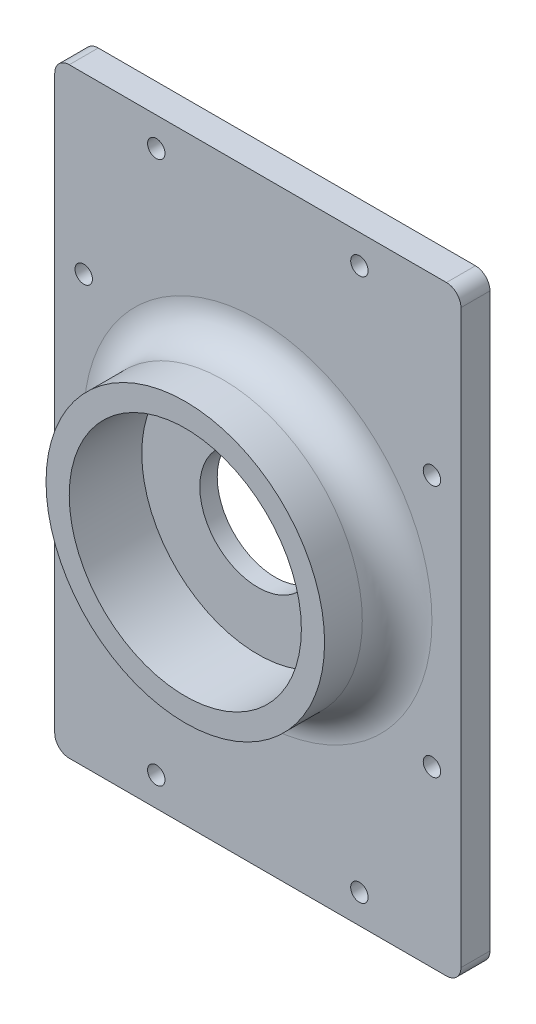
ISO-10303-21;
HEADER;
FILE_DESCRIPTION(('STEP AP214'),'2;1');
FILE_NAME('part.step','',(''),(''),'','','');
FILE_SCHEMA(('AUTOMOTIVE_DESIGN { 1 0 10303 214 1 1 1 1 }'));
ENDSEC;
DATA;
#1=APPLICATION_CONTEXT('core data for automotive mechanical design processes');
#2=APPLICATION_PROTOCOL_DEFINITION('international standard','automotive_design',2000,#1);
#3=PRODUCT_CONTEXT('',#1,'mechanical');
#4=PRODUCT('Part','Part','',(#3));
#5=PRODUCT_RELATED_PRODUCT_CATEGORY('part','',(#4));
#6=PRODUCT_DEFINITION_FORMATION('','',#4);
#7=PRODUCT_DEFINITION_CONTEXT('part definition',#1,'design');
#8=PRODUCT_DEFINITION('design','',#6,#7);
#9=PRODUCT_DEFINITION_SHAPE('','',#8);
#10=(LENGTH_UNIT() NAMED_UNIT(*) SI_UNIT(.MILLI.,.METRE.));
#11=(NAMED_UNIT(*) PLANE_ANGLE_UNIT() SI_UNIT($,.RADIAN.));
#12=(NAMED_UNIT(*) SI_UNIT($,.STERADIAN.) SOLID_ANGLE_UNIT());
#13=UNCERTAINTY_MEASURE_WITH_UNIT(LENGTH_MEASURE(1.E-05),#10,'distance_accuracy_value','');
#14=(GEOMETRIC_REPRESENTATION_CONTEXT(3) GLOBAL_UNCERTAINTY_ASSIGNED_CONTEXT((#13)) GLOBAL_UNIT_ASSIGNED_CONTEXT((#10,
#11,#12)) REPRESENTATION_CONTEXT('',''));
#15=CARTESIAN_POINT('',(0.,0.,0.));
#16=DIRECTION('',(0.,0.,1.));
#17=DIRECTION('',(1.,0.,0.));
#18=AXIS2_PLACEMENT_3D('',#15,#16,#17);
#19=CARTESIAN_POINT('',(0.,0.,-15.));
#20=DIRECTION('',(0.,0.,1.));
#21=DIRECTION('',(1.,0.,0.));
#22=AXIS2_PLACEMENT_3D('',#19,#20,#21);
#23=CYLINDRICAL_SURFACE('',#22,20.);
#24=CARTESIAN_POINT('',(0.,0.,10.));
#25=DIRECTION('',(0.,0.,-1.));
#26=DIRECTION('',(-1.,0.,0.));
#27=AXIS2_PLACEMENT_3D('',#24,#25,#26);
#28=CIRCLE('',#27,20.);
#29=CARTESIAN_POINT('',(-20.,0.,10.));
#30=VERTEX_POINT('',#29);
#31=EDGE_CURVE('E209',#30,#30,#28,.T.);
#32=ORIENTED_EDGE('',*,*,#31,.F.);
#33=EDGE_LOOP('',(#32));
#34=FACE_BOUND('',#33,.T.);
#35=CARTESIAN_POINT('',(0.,0.,3.99999999999998));
#36=DIRECTION('',(0.,0.,-1.));
#37=DIRECTION('',(-1.,0.,0.));
#38=AXIS2_PLACEMENT_3D('',#35,#36,#37);
#39=CIRCLE('',#38,20.);
#40=CARTESIAN_POINT('',(-20.,0.,3.99999999999998));
#41=VERTEX_POINT('',#40);
#42=EDGE_CURVE('E206',#41,#41,#39,.T.);
#43=ORIENTED_EDGE('',*,*,#42,.T.);
#44=EDGE_LOOP('',(#43));
#45=FACE_BOUND('',#44,.T.);
#46=ADVANCED_FACE('F46',(#34,#45),#23,.F.);
#47=CARTESIAN_POINT('',(0.,0.,10.));
#48=DIRECTION('',(0.,0.,-1.));
#49=DIRECTION('',(-1.,0.,0.));
#50=AXIS2_PLACEMENT_3D('',#47,#48,#49);
#51=PLANE('',#50);
#52=CARTESIAN_POINT('',(0.,0.,10.));
#53=DIRECTION('',(0.,0.,-1.));
#54=DIRECTION('',(-1.,0.,0.));
#55=AXIS2_PLACEMENT_3D('',#52,#53,#54);
#56=CIRCLE('',#55,60.);
#57=CARTESIAN_POINT('',(-60.,0.,10.));
#58=VERTEX_POINT('',#57);
#59=EDGE_CURVE('E55',#58,#58,#56,.T.);
#60=ORIENTED_EDGE('',*,*,#59,.T.);
#61=EDGE_LOOP('',(#60));
#62=FACE_BOUND('',#61,.T.);
#63=DIRECTION('',(1.,0.,0.));
#64=VECTOR('',#63,1.);
#65=CARTESIAN_POINT('',(-70.0000000000042,-103.5,10.));
#66=LINE('',#65,#64);
#67=CARTESIAN_POINT('',(-65.0000000000042,-103.5,10.));
#68=VERTEX_POINT('',#67);
#69=CARTESIAN_POINT('',(65.0000000000042,-103.5,10.));
#70=VERTEX_POINT('',#69);
#71=EDGE_CURVE('E157',#68,#70,#66,.T.);
#72=ORIENTED_EDGE('',*,*,#71,.T.);
#73=CARTESIAN_POINT('',(65.0000000000042,-98.5,10.));
#74=DIRECTION('',(0.,0.,-1.));
#75=DIRECTION('',(-1.,0.,0.));
#76=AXIS2_PLACEMENT_3D('',#73,#74,#75);
#77=CIRCLE('',#76,5.);
#78=CARTESIAN_POINT('',(70.0000000000042,-98.5,10.));
#79=VERTEX_POINT('',#78);
#80=EDGE_CURVE('E190',#70,#79,#77,.F.);
#81=ORIENTED_EDGE('',*,*,#80,.T.);
#82=DIRECTION('',(0.,1.,0.));
#83=VECTOR('',#82,1.);
#84=CARTESIAN_POINT('',(70.0000000000042,-103.5,10.));
#85=LINE('',#84,#83);
#86=CARTESIAN_POINT('',(70.0000000000042,98.5,10.));
#87=VERTEX_POINT('',#86);
#88=EDGE_CURVE('E135',#79,#87,#85,.T.);
#89=ORIENTED_EDGE('',*,*,#88,.T.);
#90=CARTESIAN_POINT('',(65.0000000000042,98.5,10.));
#91=DIRECTION('',(0.,0.,-1.));
#92=DIRECTION('',(-1.,0.,0.));
#93=AXIS2_PLACEMENT_3D('',#90,#91,#92);
#94=CIRCLE('',#93,5.);
#95=CARTESIAN_POINT('',(65.0000000000042,103.5,10.));
#96=VERTEX_POINT('',#95);
#97=EDGE_CURVE('E184',#87,#96,#94,.F.);
#98=ORIENTED_EDGE('',*,*,#97,.T.);
#99=DIRECTION('',(-1.,0.,0.));
#100=VECTOR('',#99,1.);
#101=CARTESIAN_POINT('',(-70.0000000000042,103.5,10.));
#102=LINE('',#101,#100);
#103=CARTESIAN_POINT('',(-65.0000000000042,103.5,10.));
#104=VERTEX_POINT('',#103);
#105=EDGE_CURVE('E325',#96,#104,#102,.T.);
#106=ORIENTED_EDGE('',*,*,#105,.T.);
#107=CARTESIAN_POINT('',(-65.0000000000042,98.5,10.));
#108=DIRECTION('',(0.,0.,-1.));
#109=DIRECTION('',(-1.,0.,0.));
#110=AXIS2_PLACEMENT_3D('',#107,#108,#109);
#111=CIRCLE('',#110,5.);
#112=CARTESIAN_POINT('',(-70.0000000000042,98.5,10.));
#113=VERTEX_POINT('',#112);
#114=EDGE_CURVE('E69',#104,#113,#111,.F.);
#115=ORIENTED_EDGE('',*,*,#114,.T.);
#116=DIRECTION('',(0.,-1.,0.));
#117=VECTOR('',#116,1.);
#118=CARTESIAN_POINT('',(-70.0000000000042,103.5,10.));
#119=LINE('',#118,#117);
#120=CARTESIAN_POINT('',(-70.0000000000042,-98.5,10.));
#121=VERTEX_POINT('',#120);
#122=EDGE_CURVE('E318',#113,#121,#119,.T.);
#123=ORIENTED_EDGE('',*,*,#122,.T.);
#124=CARTESIAN_POINT('',(-65.0000000000042,-98.5,10.));
#125=DIRECTION('',(0.,0.,-1.));
#126=DIRECTION('',(-1.,0.,0.));
#127=AXIS2_PLACEMENT_3D('',#124,#125,#126);
#128=CIRCLE('',#127,5.);
#129=EDGE_CURVE('E187',#121,#68,#128,.F.);
#130=ORIENTED_EDGE('',*,*,#129,.T.);
#131=EDGE_LOOP('',(#72,#81,#89,#98,#106,#115,#123,#130));
#132=FACE_BOUND('',#131,.T.);
#133=CARTESIAN_POINT('',(-35.0000000000042,93.5,10.));
#134=DIRECTION('',(0.,0.,1.));
#135=DIRECTION('',(1.,0.,0.));
#136=AXIS2_PLACEMENT_3D('',#133,#134,#135);
#137=CIRCLE('',#136,2.99999999999999);
#138=CARTESIAN_POINT('',(-32.0000000000042,93.5,10.));
#139=VERTEX_POINT('',#138);
#140=EDGE_CURVE('E146',#139,#139,#137,.T.);
#141=ORIENTED_EDGE('',*,*,#140,.F.);
#142=EDGE_LOOP('',(#141));
#143=FACE_BOUND('',#142,.T.);
#144=CARTESIAN_POINT('',(35.0000000000041,93.4999999999999,10.));
#145=DIRECTION('',(0.,0.,1.));
#146=DIRECTION('',(1.,0.,0.));
#147=AXIS2_PLACEMENT_3D('',#144,#145,#146);
#148=CIRCLE('',#147,2.99999999999999);
#149=CARTESIAN_POINT('',(38.0000000000041,93.4999999999999,10.));
#150=VERTEX_POINT('',#149);
#151=EDGE_CURVE('E333',#150,#150,#148,.T.);
#152=ORIENTED_EDGE('',*,*,#151,.F.);
#153=EDGE_LOOP('',(#152));
#154=FACE_BOUND('',#153,.T.);
#155=CARTESIAN_POINT('',(35.0000000000041,-93.4999999999999,10.));
#156=DIRECTION('',(0.,0.,1.));
#157=DIRECTION('',(-1.,0.,0.));
#158=AXIS2_PLACEMENT_3D('',#155,#156,#157);
#159=CIRCLE('',#158,2.99999999999999);
#160=CARTESIAN_POINT('',(32.0000000000041,-93.4999999999999,10.));
#161=VERTEX_POINT('',#160);
#162=EDGE_CURVE('E339',#161,#161,#159,.T.);
#163=ORIENTED_EDGE('',*,*,#162,.F.);
#164=EDGE_LOOP('',(#163));
#165=FACE_BOUND('',#164,.T.);
#166=CARTESIAN_POINT('',(-35.0000000000042,-93.5,10.));
#167=DIRECTION('',(0.,0.,1.));
#168=DIRECTION('',(-1.,0.,0.));
#169=AXIS2_PLACEMENT_3D('',#166,#167,#168);
#170=CIRCLE('',#169,2.99999999999999);
#171=CARTESIAN_POINT('',(-38.0000000000042,-93.5,10.));
#172=VERTEX_POINT('',#171);
#173=EDGE_CURVE('E347',#172,#172,#170,.T.);
#174=ORIENTED_EDGE('',*,*,#173,.F.);
#175=EDGE_LOOP('',(#174));
#176=FACE_BOUND('',#175,.T.);
#177=CARTESIAN_POINT('',(-60.0000000000042,-43.5,10.));
#178=DIRECTION('',(0.,0.,1.));
#179=DIRECTION('',(1.,0.,0.));
#180=AXIS2_PLACEMENT_3D('',#177,#178,#179);
#181=CIRCLE('',#180,2.99999999999999);
#182=CARTESIAN_POINT('',(-57.0000000000042,-43.5,10.));
#183=VERTEX_POINT('',#182);
#184=EDGE_CURVE('E355',#183,#183,#181,.T.);
#185=ORIENTED_EDGE('',*,*,#184,.F.);
#186=EDGE_LOOP('',(#185));
#187=FACE_BOUND('',#186,.T.);
#188=CARTESIAN_POINT('',(-60.0000000000042,43.5,10.));
#189=DIRECTION('',(0.,0.,1.));
#190=DIRECTION('',(1.,0.,0.));
#191=AXIS2_PLACEMENT_3D('',#188,#189,#190);
#192=CIRCLE('',#191,2.99999999999999);
#193=CARTESIAN_POINT('',(-57.0000000000042,43.5,10.));
#194=VERTEX_POINT('',#193);
#195=EDGE_CURVE('E363',#194,#194,#192,.T.);
#196=ORIENTED_EDGE('',*,*,#195,.F.);
#197=EDGE_LOOP('',(#196));
#198=FACE_BOUND('',#197,.T.);
#199=CARTESIAN_POINT('',(60.0000000000042,43.5,10.));
#200=DIRECTION('',(0.,0.,1.));
#201=DIRECTION('',(-1.,0.,0.));
#202=AXIS2_PLACEMENT_3D('',#199,#200,#201);
#203=CIRCLE('',#202,2.99999999999999);
#204=CARTESIAN_POINT('',(57.0000000000042,43.5,10.));
#205=VERTEX_POINT('',#204);
#206=EDGE_CURVE('E371',#205,#205,#203,.T.);
#207=ORIENTED_EDGE('',*,*,#206,.F.);
#208=EDGE_LOOP('',(#207));
#209=FACE_BOUND('',#208,.T.);
#210=CARTESIAN_POINT('',(60.0000000000042,-43.5,10.));
#211=DIRECTION('',(0.,0.,1.));
#212=DIRECTION('',(-1.,0.,0.));
#213=AXIS2_PLACEMENT_3D('',#210,#211,#212);
#214=CIRCLE('',#213,2.99999999999999);
#215=CARTESIAN_POINT('',(57.0000000000042,-43.5,10.));
#216=VERTEX_POINT('',#215);
#217=EDGE_CURVE('E379',#216,#216,#214,.T.);
#218=ORIENTED_EDGE('',*,*,#217,.F.);
#219=EDGE_LOOP('',(#218));
#220=FACE_BOUND('',#219,.T.);
#221=ADVANCED_FACE('F215',(#62,#132,#143,#154,#165,#176,#187,#198,#209,#220),#51,.F.);
#222=CARTESIAN_POINT('',(0.,0.,0.));
#223=DIRECTION('',(0.,0.,-1.));
#224=DIRECTION('',(-1.,0.,0.));
#225=AXIS2_PLACEMENT_3D('',#222,#223,#224);
#226=PLANE('',#225);
#227=CARTESIAN_POINT('',(0.,0.,0.));
#228=DIRECTION('',(0.,0.,-1.));
#229=DIRECTION('',(-1.,0.,0.));
#230=AXIS2_PLACEMENT_3D('',#227,#228,#229);
#231=CIRCLE('',#230,30.);
#232=CARTESIAN_POINT('',(-30.,0.,0.));
#233=VERTEX_POINT('',#232);
#234=EDGE_CURVE('E401',#233,#233,#231,.T.);
#235=ORIENTED_EDGE('',*,*,#234,.F.);
#236=EDGE_LOOP('',(#235));
#237=FACE_BOUND('',#236,.T.);
#238=CARTESIAN_POINT('',(60.0000000000042,43.5,0.));
#239=DIRECTION('',(0.,0.,1.));
#240=DIRECTION('',(-1.,0.,0.));
#241=AXIS2_PLACEMENT_3D('',#238,#239,#240);
#242=CIRCLE('',#241,2.99999999999999);
#243=CARTESIAN_POINT('',(57.0000000000042,43.5,0.));
#244=VERTEX_POINT('',#243);
#245=EDGE_CURVE('E375',#244,#244,#242,.T.);
#246=ORIENTED_EDGE('',*,*,#245,.T.);
#247=EDGE_LOOP('',(#246));
#248=FACE_BOUND('',#247,.T.);
#249=CARTESIAN_POINT('',(-60.0000000000042,-43.5,0.));
#250=DIRECTION('',(0.,0.,1.));
#251=DIRECTION('',(1.,0.,0.));
#252=AXIS2_PLACEMENT_3D('',#249,#250,#251);
#253=CIRCLE('',#252,2.99999999999999);
#254=CARTESIAN_POINT('',(-57.0000000000042,-43.5,0.));
#255=VERTEX_POINT('',#254);
#256=EDGE_CURVE('E359',#255,#255,#253,.T.);
#257=ORIENTED_EDGE('',*,*,#256,.T.);
#258=EDGE_LOOP('',(#257));
#259=FACE_BOUND('',#258,.T.);
#260=CARTESIAN_POINT('',(35.0000000000041,-93.4999999999999,0.));
#261=DIRECTION('',(0.,0.,1.));
#262=DIRECTION('',(-1.,0.,0.));
#263=AXIS2_PLACEMENT_3D('',#260,#261,#262);
#264=CIRCLE('',#263,2.99999999999999);
#265=CARTESIAN_POINT('',(32.0000000000041,-93.4999999999999,0.));
#266=VERTEX_POINT('',#265);
#267=EDGE_CURVE('E343',#266,#266,#264,.T.);
#268=ORIENTED_EDGE('',*,*,#267,.T.);
#269=EDGE_LOOP('',(#268));
#270=FACE_BOUND('',#269,.T.);
#271=CARTESIAN_POINT('',(-35.0000000000042,93.5,0.));
#272=DIRECTION('',(0.,0.,1.));
#273=DIRECTION('',(1.,0.,0.));
#274=AXIS2_PLACEMENT_3D('',#271,#272,#273);
#275=CIRCLE('',#274,2.99999999999999);
#276=CARTESIAN_POINT('',(-32.0000000000042,93.5,0.));
#277=VERTEX_POINT('',#276);
#278=EDGE_CURVE('E154',#277,#277,#275,.T.);
#279=ORIENTED_EDGE('',*,*,#278,.T.);
#280=EDGE_LOOP('',(#279));
#281=FACE_BOUND('',#280,.T.);
#282=DIRECTION('',(0.,1.,0.));
#283=VECTOR('',#282,1.);
#284=CARTESIAN_POINT('',(70.0000000000042,-103.5,0.));
#285=LINE('',#284,#283);
#286=CARTESIAN_POINT('',(70.0000000000042,-98.5,0.));
#287=VERTEX_POINT('',#286);
#288=CARTESIAN_POINT('',(70.0000000000042,98.5,0.));
#289=VERTEX_POINT('',#288);
#290=EDGE_CURVE('E132',#287,#289,#285,.T.);
#291=ORIENTED_EDGE('',*,*,#290,.F.);
#292=CARTESIAN_POINT('',(65.0000000000042,-98.5,0.));
#293=DIRECTION('',(0.,0.,-1.));
#294=DIRECTION('',(-1.,0.,0.));
#295=AXIS2_PLACEMENT_3D('',#292,#293,#294);
#296=CIRCLE('',#295,5.);
#297=CARTESIAN_POINT('',(65.0000000000042,-103.5,0.));
#298=VERTEX_POINT('',#297);
#299=EDGE_CURVE('E114',#287,#298,#296,.T.);
#300=ORIENTED_EDGE('',*,*,#299,.T.);
#301=DIRECTION('',(1.,0.,0.));
#302=VECTOR('',#301,1.);
#303=CARTESIAN_POINT('',(-70.0000000000042,-103.5,0.));
#304=LINE('',#303,#302);
#305=CARTESIAN_POINT('',(-65.0000000000042,-103.5,0.));
#306=VERTEX_POINT('',#305);
#307=EDGE_CURVE('E162',#306,#298,#304,.T.);
#308=ORIENTED_EDGE('',*,*,#307,.F.);
#309=CARTESIAN_POINT('',(-65.0000000000042,-98.5,0.));
#310=DIRECTION('',(0.,0.,-1.));
#311=DIRECTION('',(-1.,0.,0.));
#312=AXIS2_PLACEMENT_3D('',#309,#310,#311);
#313=CIRCLE('',#312,5.);
#314=CARTESIAN_POINT('',(-70.0000000000042,-98.5,0.));
#315=VERTEX_POINT('',#314);
#316=EDGE_CURVE('E126',#306,#315,#313,.T.);
#317=ORIENTED_EDGE('',*,*,#316,.T.);
#318=DIRECTION('',(0.,-1.,0.));
#319=VECTOR('',#318,1.);
#320=CARTESIAN_POINT('',(-70.0000000000042,103.5,0.));
#321=LINE('',#320,#319);
#322=CARTESIAN_POINT('',(-70.0000000000042,98.5,0.));
#323=VERTEX_POINT('',#322);
#324=EDGE_CURVE('E151',#323,#315,#321,.T.);
#325=ORIENTED_EDGE('',*,*,#324,.F.);
#326=CARTESIAN_POINT('',(-65.0000000000042,98.5,0.));
#327=DIRECTION('',(0.,0.,-1.));
#328=DIRECTION('',(-1.,0.,0.));
#329=AXIS2_PLACEMENT_3D('',#326,#327,#328);
#330=CIRCLE('',#329,5.);
#331=CARTESIAN_POINT('',(-65.0000000000042,103.5,0.));
#332=VERTEX_POINT('',#331);
#333=EDGE_CURVE('E137',#323,#332,#330,.T.);
#334=ORIENTED_EDGE('',*,*,#333,.T.);
#335=DIRECTION('',(-1.,0.,0.));
#336=VECTOR('',#335,1.);
#337=CARTESIAN_POINT('',(-70.0000000000042,103.5,0.));
#338=LINE('',#337,#336);
#339=CARTESIAN_POINT('',(65.0000000000042,103.5,0.));
#340=VERTEX_POINT('',#339);
#341=EDGE_CURVE('E145',#340,#332,#338,.T.);
#342=ORIENTED_EDGE('',*,*,#341,.F.);
#343=CARTESIAN_POINT('',(65.0000000000042,98.5,0.));
#344=DIRECTION('',(0.,0.,-1.));
#345=DIRECTION('',(-1.,0.,0.));
#346=AXIS2_PLACEMENT_3D('',#343,#344,#345);
#347=CIRCLE('',#346,5.);
#348=EDGE_CURVE('E143',#340,#289,#347,.T.);
#349=ORIENTED_EDGE('',*,*,#348,.T.);
#350=EDGE_LOOP('',(#291,#300,#308,#317,#325,#334,#342,#349));
#351=FACE_BOUND('',#350,.T.);
#352=CARTESIAN_POINT('',(35.0000000000041,93.4999999999999,0.));
#353=DIRECTION('',(0.,0.,1.));
#354=DIRECTION('',(1.,0.,0.));
#355=AXIS2_PLACEMENT_3D('',#352,#353,#354);
#356=CIRCLE('',#355,2.99999999999999);
#357=CARTESIAN_POINT('',(38.0000000000041,93.4999999999999,0.));
#358=VERTEX_POINT('',#357);
#359=EDGE_CURVE('E335',#358,#358,#356,.T.);
#360=ORIENTED_EDGE('',*,*,#359,.T.);
#361=EDGE_LOOP('',(#360));
#362=FACE_BOUND('',#361,.T.);
#363=CARTESIAN_POINT('',(-35.0000000000042,-93.5,0.));
#364=DIRECTION('',(0.,0.,1.));
#365=DIRECTION('',(-1.,0.,0.));
#366=AXIS2_PLACEMENT_3D('',#363,#364,#365);
#367=CIRCLE('',#366,2.99999999999999);
#368=CARTESIAN_POINT('',(-38.0000000000042,-93.5,0.));
#369=VERTEX_POINT('',#368);
#370=EDGE_CURVE('E351',#369,#369,#367,.T.);
#371=ORIENTED_EDGE('',*,*,#370,.T.);
#372=EDGE_LOOP('',(#371));
#373=FACE_BOUND('',#372,.T.);
#374=CARTESIAN_POINT('',(-60.0000000000042,43.5,0.));
#375=DIRECTION('',(0.,0.,1.));
#376=DIRECTION('',(1.,0.,0.));
#377=AXIS2_PLACEMENT_3D('',#374,#375,#376);
#378=CIRCLE('',#377,2.99999999999999);
#379=CARTESIAN_POINT('',(-57.0000000000042,43.5,0.));
#380=VERTEX_POINT('',#379);
#381=EDGE_CURVE('E367',#380,#380,#378,.T.);
#382=ORIENTED_EDGE('',*,*,#381,.T.);
#383=EDGE_LOOP('',(#382));
#384=FACE_BOUND('',#383,.T.);
#385=CARTESIAN_POINT('',(60.0000000000042,-43.5,0.));
#386=DIRECTION('',(0.,0.,1.));
#387=DIRECTION('',(-1.,0.,0.));
#388=AXIS2_PLACEMENT_3D('',#385,#386,#387);
#389=CIRCLE('',#388,2.99999999999999);
#390=CARTESIAN_POINT('',(57.0000000000042,-43.5,0.));
#391=VERTEX_POINT('',#390);
#392=EDGE_CURVE('E383',#391,#391,#389,.T.);
#393=ORIENTED_EDGE('',*,*,#392,.T.);
#394=EDGE_LOOP('',(#393));
#395=FACE_BOUND('',#394,.T.);
#396=ADVANCED_FACE('F140',(#237,#248,#259,#270,#281,#351,#362,#373,#384,#395),#226,.T.);
#397=CARTESIAN_POINT('',(70.0000000000042,-103.5,10.));
#398=DIRECTION('',(-1.,0.,0.));
#399=DIRECTION('',(0.,0.,1.));
#400=AXIS2_PLACEMENT_3D('',#397,#398,#399);
#401=PLANE('',#400);
#402=ORIENTED_EDGE('',*,*,#88,.F.);
#403=DIRECTION('',(0.,0.,-1.));
#404=VECTOR('',#403,1.);
#405=CARTESIAN_POINT('',(70.0000000000042,-98.5,10.));
#406=LINE('',#405,#404);
#407=EDGE_CURVE('E118',#79,#287,#406,.T.);
#408=ORIENTED_EDGE('',*,*,#407,.T.);
#409=ORIENTED_EDGE('',*,*,#290,.T.);
#410=DIRECTION('',(0.,0.,-1.));
#411=VECTOR('',#410,1.);
#412=CARTESIAN_POINT('',(70.0000000000042,98.5,10.));
#413=LINE('',#412,#411);
#414=EDGE_CURVE('E138',#289,#87,#413,.F.);
#415=ORIENTED_EDGE('',*,*,#414,.T.);
#416=EDGE_LOOP('',(#402,#408,#409,#415));
#417=FACE_BOUND('',#416,.T.);
#418=ADVANCED_FACE('F131',(#417),#401,.F.);
#419=CARTESIAN_POINT('',(-70.0000000000042,103.5,10.));
#420=DIRECTION('',(0.,-1.,0.));
#421=DIRECTION('',(0.,0.,-1.));
#422=AXIS2_PLACEMENT_3D('',#419,#420,#421);
#423=PLANE('',#422);
#424=ORIENTED_EDGE('',*,*,#105,.F.);
#425=DIRECTION('',(0.,0.,-1.));
#426=VECTOR('',#425,1.);
#427=CARTESIAN_POINT('',(65.0000000000042,103.5,10.));
#428=LINE('',#427,#426);
#429=EDGE_CURVE('E202',#96,#340,#428,.T.);
#430=ORIENTED_EDGE('',*,*,#429,.T.);
#431=ORIENTED_EDGE('',*,*,#341,.T.);
#432=DIRECTION('',(0.,0.,-1.));
#433=VECTOR('',#432,1.);
#434=CARTESIAN_POINT('',(-65.0000000000042,103.5,10.));
#435=LINE('',#434,#433);
#436=EDGE_CURVE('E199',#332,#104,#435,.F.);
#437=ORIENTED_EDGE('',*,*,#436,.T.);
#438=EDGE_LOOP('',(#424,#430,#431,#437));
#439=FACE_BOUND('',#438,.T.);
#440=ADVANCED_FACE('F293',(#439),#423,.F.);
#441=CARTESIAN_POINT('',(-70.0000000000042,103.5,10.));
#442=DIRECTION('',(1.,0.,0.));
#443=DIRECTION('',(0.,0.,-1.));
#444=AXIS2_PLACEMENT_3D('',#441,#442,#443);
#445=PLANE('',#444);
#446=ORIENTED_EDGE('',*,*,#324,.T.);
#447=DIRECTION('',(0.,0.,-1.));
#448=VECTOR('',#447,1.);
#449=CARTESIAN_POINT('',(-70.0000000000042,-98.5,10.));
#450=LINE('',#449,#448);
#451=EDGE_CURVE('E62',#315,#121,#450,.F.);
#452=ORIENTED_EDGE('',*,*,#451,.T.);
#453=ORIENTED_EDGE('',*,*,#122,.F.);
#454=DIRECTION('',(0.,0.,-1.));
#455=VECTOR('',#454,1.);
#456=CARTESIAN_POINT('',(-70.0000000000042,98.5,10.));
#457=LINE('',#456,#455);
#458=EDGE_CURVE('E193',#113,#323,#457,.T.);
#459=ORIENTED_EDGE('',*,*,#458,.T.);
#460=EDGE_LOOP('',(#446,#452,#453,#459));
#461=FACE_BOUND('',#460,.T.);
#462=ADVANCED_FACE('F289',(#461),#445,.F.);
#463=CARTESIAN_POINT('',(-70.0000000000042,-103.5,10.));
#464=DIRECTION('',(0.,1.,0.));
#465=DIRECTION('',(0.,0.,1.));
#466=AXIS2_PLACEMENT_3D('',#463,#464,#465);
#467=PLANE('',#466);
#468=ORIENTED_EDGE('',*,*,#307,.T.);
#469=DIRECTION('',(0.,0.,-1.));
#470=VECTOR('',#469,1.);
#471=CARTESIAN_POINT('',(65.0000000000042,-103.5,10.));
#472=LINE('',#471,#470);
#473=EDGE_CURVE('E119',#298,#70,#472,.F.);
#474=ORIENTED_EDGE('',*,*,#473,.T.);
#475=ORIENTED_EDGE('',*,*,#71,.F.);
#476=DIRECTION('',(0.,0.,-1.));
#477=VECTOR('',#476,1.);
#478=CARTESIAN_POINT('',(-65.0000000000042,-103.5,10.));
#479=LINE('',#478,#477);
#480=EDGE_CURVE('E125',#68,#306,#479,.T.);
#481=ORIENTED_EDGE('',*,*,#480,.T.);
#482=EDGE_LOOP('',(#468,#474,#475,#481));
#483=FACE_BOUND('',#482,.T.);
#484=ADVANCED_FACE('F281',(#483),#467,.F.);
#485=CARTESIAN_POINT('',(-35.0000000000042,93.5,10.));
#486=DIRECTION('',(0.,0.,-1.));
#487=DIRECTION('',(-1.,0.,0.));
#488=AXIS2_PLACEMENT_3D('',#485,#486,#487);
#489=CYLINDRICAL_SURFACE('',#488,2.99999999999999);
#490=ORIENTED_EDGE('',*,*,#140,.T.);
#491=EDGE_LOOP('',(#490));
#492=FACE_BOUND('',#491,.T.);
#493=ORIENTED_EDGE('',*,*,#278,.F.);
#494=EDGE_LOOP('',(#493));
#495=FACE_BOUND('',#494,.T.);
#496=ADVANCED_FACE('F278',(#492,#495),#489,.F.);
#497=CARTESIAN_POINT('',(35.0000000000041,93.4999999999999,10.));
#498=DIRECTION('',(0.,0.,-1.));
#499=DIRECTION('',(-1.,0.,0.));
#500=AXIS2_PLACEMENT_3D('',#497,#498,#499);
#501=CYLINDRICAL_SURFACE('',#500,2.99999999999999);
#502=ORIENTED_EDGE('',*,*,#151,.T.);
#503=EDGE_LOOP('',(#502));
#504=FACE_BOUND('',#503,.T.);
#505=ORIENTED_EDGE('',*,*,#359,.F.);
#506=EDGE_LOOP('',(#505));
#507=FACE_BOUND('',#506,.T.);
#508=ADVANCED_FACE('F274',(#504,#507),#501,.F.);
#509=CARTESIAN_POINT('',(35.0000000000041,-93.4999999999999,10.));
#510=DIRECTION('',(0.,0.,-1.));
#511=DIRECTION('',(-1.,0.,0.));
#512=AXIS2_PLACEMENT_3D('',#509,#510,#511);
#513=CYLINDRICAL_SURFACE('',#512,2.99999999999999);
#514=ORIENTED_EDGE('',*,*,#162,.T.);
#515=EDGE_LOOP('',(#514));
#516=FACE_BOUND('',#515,.T.);
#517=ORIENTED_EDGE('',*,*,#267,.F.);
#518=EDGE_LOOP('',(#517));
#519=FACE_BOUND('',#518,.T.);
#520=ADVANCED_FACE('F270',(#516,#519),#513,.F.);
#521=CARTESIAN_POINT('',(-35.0000000000042,-93.5,10.));
#522=DIRECTION('',(0.,0.,-1.));
#523=DIRECTION('',(-1.,0.,0.));
#524=AXIS2_PLACEMENT_3D('',#521,#522,#523);
#525=CYLINDRICAL_SURFACE('',#524,2.99999999999999);
#526=ORIENTED_EDGE('',*,*,#173,.T.);
#527=EDGE_LOOP('',(#526));
#528=FACE_BOUND('',#527,.T.);
#529=ORIENTED_EDGE('',*,*,#370,.F.);
#530=EDGE_LOOP('',(#529));
#531=FACE_BOUND('',#530,.T.);
#532=ADVANCED_FACE('F266',(#528,#531),#525,.F.);
#533=CARTESIAN_POINT('',(-60.0000000000042,-43.5,10.));
#534=DIRECTION('',(0.,0.,-1.));
#535=DIRECTION('',(-1.,0.,0.));
#536=AXIS2_PLACEMENT_3D('',#533,#534,#535);
#537=CYLINDRICAL_SURFACE('',#536,2.99999999999999);
#538=ORIENTED_EDGE('',*,*,#184,.T.);
#539=EDGE_LOOP('',(#538));
#540=FACE_BOUND('',#539,.T.);
#541=ORIENTED_EDGE('',*,*,#256,.F.);
#542=EDGE_LOOP('',(#541));
#543=FACE_BOUND('',#542,.T.);
#544=ADVANCED_FACE('F262',(#540,#543),#537,.F.);
#545=CARTESIAN_POINT('',(-60.0000000000042,43.5,10.));
#546=DIRECTION('',(0.,0.,-1.));
#547=DIRECTION('',(-1.,0.,0.));
#548=AXIS2_PLACEMENT_3D('',#545,#546,#547);
#549=CYLINDRICAL_SURFACE('',#548,2.99999999999999);
#550=ORIENTED_EDGE('',*,*,#195,.T.);
#551=EDGE_LOOP('',(#550));
#552=FACE_BOUND('',#551,.T.);
#553=ORIENTED_EDGE('',*,*,#381,.F.);
#554=EDGE_LOOP('',(#553));
#555=FACE_BOUND('',#554,.T.);
#556=ADVANCED_FACE('F258',(#552,#555),#549,.F.);
#557=CARTESIAN_POINT('',(60.0000000000042,43.5,10.));
#558=DIRECTION('',(0.,0.,-1.));
#559=DIRECTION('',(-1.,0.,0.));
#560=AXIS2_PLACEMENT_3D('',#557,#558,#559);
#561=CYLINDRICAL_SURFACE('',#560,2.99999999999999);
#562=ORIENTED_EDGE('',*,*,#206,.T.);
#563=EDGE_LOOP('',(#562));
#564=FACE_BOUND('',#563,.T.);
#565=ORIENTED_EDGE('',*,*,#245,.F.);
#566=EDGE_LOOP('',(#565));
#567=FACE_BOUND('',#566,.T.);
#568=ADVANCED_FACE('F254',(#564,#567),#561,.F.);
#569=CARTESIAN_POINT('',(60.0000000000042,-43.5,10.));
#570=DIRECTION('',(0.,0.,-1.));
#571=DIRECTION('',(-1.,0.,0.));
#572=AXIS2_PLACEMENT_3D('',#569,#570,#571);
#573=CYLINDRICAL_SURFACE('',#572,2.99999999999999);
#574=ORIENTED_EDGE('',*,*,#217,.T.);
#575=EDGE_LOOP('',(#574));
#576=FACE_BOUND('',#575,.T.);
#577=ORIENTED_EDGE('',*,*,#392,.F.);
#578=EDGE_LOOP('',(#577));
#579=FACE_BOUND('',#578,.T.);
#580=ADVANCED_FACE('F250',(#576,#579),#573,.F.);
#581=CARTESIAN_POINT('',(0.,0.,35.));
#582=DIRECTION('',(0.,0.,-1.));
#583=DIRECTION('',(-1.,0.,0.));
#584=AXIS2_PLACEMENT_3D('',#581,#582,#583);
#585=CYLINDRICAL_SURFACE('',#584,48.);
#586=CARTESIAN_POINT('',(0.,0.,22.));
#587=DIRECTION('',(0.,0.,-1.));
#588=DIRECTION('',(-1.,0.,0.));
#589=AXIS2_PLACEMENT_3D('',#586,#587,#588);
#590=CIRCLE('',#589,48.);
#591=CARTESIAN_POINT('',(-48.,0.,22.));
#592=VERTEX_POINT('',#591);
#593=EDGE_CURVE('E11',#592,#592,#590,.F.);
#594=ORIENTED_EDGE('',*,*,#593,.T.);
#595=EDGE_LOOP('',(#594));
#596=FACE_BOUND('',#595,.T.);
#597=CARTESIAN_POINT('',(0.,0.,35.));
#598=DIRECTION('',(0.,0.,-1.));
#599=DIRECTION('',(-1.,0.,0.));
#600=AXIS2_PLACEMENT_3D('',#597,#598,#599);
#601=CIRCLE('',#600,48.);
#602=CARTESIAN_POINT('',(-48.,0.,35.));
#603=VERTEX_POINT('',#602);
#604=EDGE_CURVE('E387',#603,#603,#601,.T.);
#605=ORIENTED_EDGE('',*,*,#604,.T.);
#606=EDGE_LOOP('',(#605));
#607=FACE_BOUND('',#606,.T.);
#608=ADVANCED_FACE('F246',(#596,#607),#585,.T.);
#609=CARTESIAN_POINT('',(0.,0.,35.));
#610=DIRECTION('',(0.,0.,-1.));
#611=DIRECTION('',(-1.,0.,0.));
#612=AXIS2_PLACEMENT_3D('',#609,#610,#611);
#613=PLANE('',#612);
#614=CARTESIAN_POINT('',(0.,0.,35.));
#615=DIRECTION('',(0.,0.,-1.));
#616=DIRECTION('',(-1.,0.,0.));
#617=AXIS2_PLACEMENT_3D('',#614,#615,#616);
#618=CIRCLE('',#617,40.);
#619=CARTESIAN_POINT('',(-40.,0.,35.));
#620=VERTEX_POINT('',#619);
#621=EDGE_CURVE('E394',#620,#620,#618,.T.);
#622=ORIENTED_EDGE('',*,*,#621,.T.);
#623=EDGE_LOOP('',(#622));
#624=FACE_BOUND('',#623,.T.);
#625=ORIENTED_EDGE('',*,*,#604,.F.);
#626=EDGE_LOOP('',(#625));
#627=FACE_BOUND('',#626,.T.);
#628=ADVANCED_FACE('F242',(#624,#627),#613,.F.);
#629=CARTESIAN_POINT('',(0.,0.,35.));
#630=DIRECTION('',(0.,0.,-1.));
#631=DIRECTION('',(-1.,0.,0.));
#632=AXIS2_PLACEMENT_3D('',#629,#630,#631);
#633=CYLINDRICAL_SURFACE('',#632,40.);
#634=ORIENTED_EDGE('',*,*,#621,.F.);
#635=EDGE_LOOP('',(#634));
#636=FACE_BOUND('',#635,.T.);
#637=CARTESIAN_POINT('',(0.,0.,10.));
#638=DIRECTION('',(0.,0.,-1.));
#639=DIRECTION('',(-1.,0.,0.));
#640=AXIS2_PLACEMENT_3D('',#637,#638,#639);
#641=CIRCLE('',#640,40.);
#642=CARTESIAN_POINT('',(-40.,0.,10.));
#643=VERTEX_POINT('',#642);
#644=EDGE_CURVE('E165',#643,#643,#641,.T.);
#645=ORIENTED_EDGE('',*,*,#644,.T.);
#646=EDGE_LOOP('',(#645));
#647=FACE_BOUND('',#646,.T.);
#648=ADVANCED_FACE('F239',(#636,#647),#633,.F.);
#649=ORIENTED_EDGE('',*,*,#31,.T.);
#650=EDGE_LOOP('',(#649));
#651=FACE_BOUND('',#650,.T.);
#652=ORIENTED_EDGE('',*,*,#644,.F.);
#653=EDGE_LOOP('',(#652));
#654=FACE_BOUND('',#653,.T.);
#655=ADVANCED_FACE('F234',(#651,#654),#51,.F.);
#656=CARTESIAN_POINT('',(65.0000000000042,-98.5,10.));
#657=DIRECTION('',(0.,0.,-1.));
#658=DIRECTION('',(-1.,0.,0.));
#659=AXIS2_PLACEMENT_3D('',#656,#657,#658);
#660=CYLINDRICAL_SURFACE('',#659,5.);
#661=ORIENTED_EDGE('',*,*,#80,.F.);
#662=ORIENTED_EDGE('',*,*,#473,.F.);
#663=ORIENTED_EDGE('',*,*,#299,.F.);
#664=ORIENTED_EDGE('',*,*,#407,.F.);
#665=EDGE_LOOP('',(#661,#662,#663,#664));
#666=FACE_BOUND('',#665,.T.);
#667=ADVANCED_FACE('F117',(#666),#660,.T.);
#668=CARTESIAN_POINT('',(-65.0000000000042,-98.5,10.));
#669=DIRECTION('',(0.,0.,-1.));
#670=DIRECTION('',(-1.,0.,0.));
#671=AXIS2_PLACEMENT_3D('',#668,#669,#670);
#672=CYLINDRICAL_SURFACE('',#671,5.);
#673=ORIENTED_EDGE('',*,*,#129,.F.);
#674=ORIENTED_EDGE('',*,*,#451,.F.);
#675=ORIENTED_EDGE('',*,*,#316,.F.);
#676=ORIENTED_EDGE('',*,*,#480,.F.);
#677=EDGE_LOOP('',(#673,#674,#675,#676));
#678=FACE_BOUND('',#677,.T.);
#679=ADVANCED_FACE('F301',(#678),#672,.T.);
#680=CARTESIAN_POINT('',(65.0000000000042,98.5,10.));
#681=DIRECTION('',(0.,0.,-1.));
#682=DIRECTION('',(-1.,0.,0.));
#683=AXIS2_PLACEMENT_3D('',#680,#681,#682);
#684=CYLINDRICAL_SURFACE('',#683,5.);
#685=ORIENTED_EDGE('',*,*,#97,.F.);
#686=ORIENTED_EDGE('',*,*,#414,.F.);
#687=ORIENTED_EDGE('',*,*,#348,.F.);
#688=ORIENTED_EDGE('',*,*,#429,.F.);
#689=EDGE_LOOP('',(#685,#686,#687,#688));
#690=FACE_BOUND('',#689,.T.);
#691=ADVANCED_FACE('F304',(#690),#684,.T.);
#692=CARTESIAN_POINT('',(-65.0000000000042,98.5,10.));
#693=DIRECTION('',(0.,0.,-1.));
#694=DIRECTION('',(-1.,0.,0.));
#695=AXIS2_PLACEMENT_3D('',#692,#693,#694);
#696=CYLINDRICAL_SURFACE('',#695,5.);
#697=ORIENTED_EDGE('',*,*,#114,.F.);
#698=ORIENTED_EDGE('',*,*,#436,.F.);
#699=ORIENTED_EDGE('',*,*,#333,.F.);
#700=ORIENTED_EDGE('',*,*,#458,.F.);
#701=EDGE_LOOP('',(#697,#698,#699,#700));
#702=FACE_BOUND('',#701,.T.);
#703=ADVANCED_FACE('F307',(#702),#696,.T.);
#704=CARTESIAN_POINT('',(0.,0.,3.99999999999998));
#705=DIRECTION('',(0.,0.,-1.));
#706=DIRECTION('',(-1.,0.,0.));
#707=AXIS2_PLACEMENT_3D('',#704,#705,#706);
#708=CYLINDRICAL_SURFACE('',#707,30.);
#709=CARTESIAN_POINT('',(0.,0.,3.99999999999998));
#710=DIRECTION('',(0.,0.,-1.));
#711=DIRECTION('',(-1.,0.,0.));
#712=AXIS2_PLACEMENT_3D('',#709,#710,#711);
#713=CIRCLE('',#712,30.);
#714=CARTESIAN_POINT('',(-30.,0.,3.99999999999998));
#715=VERTEX_POINT('',#714);
#716=EDGE_CURVE('E210',#715,#715,#713,.T.);
#717=ORIENTED_EDGE('',*,*,#716,.F.);
#718=EDGE_LOOP('',(#717));
#719=FACE_BOUND('',#718,.T.);
#720=ORIENTED_EDGE('',*,*,#234,.T.);
#721=EDGE_LOOP('',(#720));
#722=FACE_BOUND('',#721,.T.);
#723=ADVANCED_FACE('F223',(#719,#722),#708,.F.);
#724=CARTESIAN_POINT('',(0.,0.,3.99999999999998));
#725=DIRECTION('',(0.,0.,-1.));
#726=DIRECTION('',(-1.,0.,0.));
#727=AXIS2_PLACEMENT_3D('',#724,#725,#726);
#728=PLANE('',#727);
#729=ORIENTED_EDGE('',*,*,#42,.F.);
#730=EDGE_LOOP('',(#729));
#731=FACE_BOUND('',#730,.T.);
#732=ORIENTED_EDGE('',*,*,#716,.T.);
#733=EDGE_LOOP('',(#732));
#734=FACE_BOUND('',#733,.T.);
#735=ADVANCED_FACE('F218',(#731,#734),#728,.T.);
#736=CARTESIAN_POINT('',(0.,0.,22.));
#737=DIRECTION('',(0.,0.,-1.));
#738=DIRECTION('',(-1.,0.,0.));
#739=AXIS2_PLACEMENT_3D('',#736,#737,#738);
#740=TOROIDAL_SURFACE('',#739,60.,12.);
#741=ORIENTED_EDGE('',*,*,#593,.F.);
#742=EDGE_LOOP('',(#741));
#743=FACE_BOUND('',#742,.T.);
#744=ORIENTED_EDGE('',*,*,#59,.F.);
#745=EDGE_LOOP('',(#744));
#746=FACE_BOUND('',#745,.T.);
#747=ADVANCED_FACE('F48',(#743,#746),#740,.F.);
#748=CLOSED_SHELL('',(#46,#221,#396,#418,#440,#462,#484,#496,#508,#520,#532,#544,#556,#568,#580,
#608,#628,#648,#655,#667,#679,#691,#703,#723,#735,#747));
#749=MANIFOLD_SOLID_BREP('B2',#748);
#750=ADVANCED_BREP_SHAPE_REPRESENTATION('',(#18,#749),#14);
#751=SHAPE_DEFINITION_REPRESENTATION(#9,#750);
ENDSEC;
END-ISO-10303-21;
